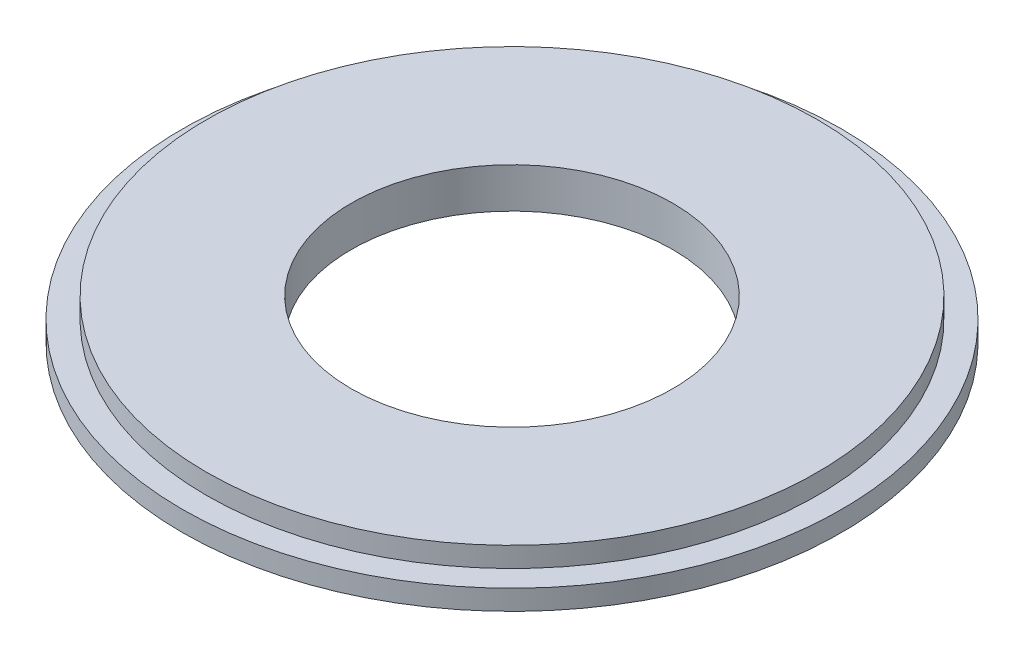
ISO-10303-21;
HEADER;
FILE_DESCRIPTION(('STEP AP214'),'2;1');
FILE_NAME('part.step','',(''),(''),'','','');
FILE_SCHEMA(('AUTOMOTIVE_DESIGN { 1 0 10303 214 1 1 1 1 }'));
ENDSEC;
DATA;
#1=APPLICATION_CONTEXT('core data for automotive mechanical design processes');
#2=APPLICATION_PROTOCOL_DEFINITION('international standard','automotive_design',2000,#1);
#3=PRODUCT_CONTEXT('',#1,'mechanical');
#4=PRODUCT('Part','Part','',(#3));
#5=PRODUCT_RELATED_PRODUCT_CATEGORY('part','',(#4));
#6=PRODUCT_DEFINITION_FORMATION('','',#4);
#7=PRODUCT_DEFINITION_CONTEXT('part definition',#1,'design');
#8=PRODUCT_DEFINITION('design','',#6,#7);
#9=PRODUCT_DEFINITION_SHAPE('','',#8);
#10=(LENGTH_UNIT() NAMED_UNIT(*) SI_UNIT(.MILLI.,.METRE.));
#11=(NAMED_UNIT(*) PLANE_ANGLE_UNIT() SI_UNIT($,.RADIAN.));
#12=(NAMED_UNIT(*) SI_UNIT($,.STERADIAN.) SOLID_ANGLE_UNIT());
#13=UNCERTAINTY_MEASURE_WITH_UNIT(LENGTH_MEASURE(1.E-05),#10,'distance_accuracy_value','');
#14=(GEOMETRIC_REPRESENTATION_CONTEXT(3) GLOBAL_UNCERTAINTY_ASSIGNED_CONTEXT((#13)) GLOBAL_UNIT_ASSIGNED_CONTEXT((#10,
#11,#12)) REPRESENTATION_CONTEXT('',''));
#15=CARTESIAN_POINT('',(0.,0.,0.));
#16=DIRECTION('',(0.,0.,1.));
#17=DIRECTION('',(1.,0.,0.));
#18=AXIS2_PLACEMENT_3D('',#15,#16,#17);
#19=CARTESIAN_POINT('',(0.,2.5,0.0159774867312799));
#20=DIRECTION('',(0.,1.,0.));
#21=DIRECTION('',(0.,0.,1.));
#22=AXIS2_PLACEMENT_3D('',#19,#20,#21);
#23=PLANE('',#22);
#24=CARTESIAN_POINT('',(0.,2.5,0.0159774867312799));
#25=DIRECTION('',(0.,1.,0.));
#26=DIRECTION('',(0.,0.,1.));
#27=AXIS2_PLACEMENT_3D('',#24,#25,#26);
#28=CIRCLE('',#27,38.);
#29=CARTESIAN_POINT('',(0.,2.5,38.0159774867313));
#30=VERTEX_POINT('',#29);
#31=EDGE_CURVE('E11',#30,#30,#28,.T.);
#32=ORIENTED_EDGE('',*,*,#31,.F.);
#33=EDGE_LOOP('',(#32));
#34=FACE_BOUND('',#33,.T.);
#35=CARTESIAN_POINT('',(0.,2.5,0.0159774867312799));
#36=DIRECTION('',(0.,1.,0.));
#37=DIRECTION('',(0.,0.,1.));
#38=AXIS2_PLACEMENT_3D('',#35,#36,#37);
#39=CIRCLE('',#38,41.);
#40=CARTESIAN_POINT('',(0.,2.5,41.0159774867313));
#41=VERTEX_POINT('',#40);
#42=EDGE_CURVE('E51',#41,#41,#39,.T.);
#43=ORIENTED_EDGE('',*,*,#42,.T.);
#44=EDGE_LOOP('',(#43));
#45=FACE_BOUND('',#44,.T.);
#46=ADVANCED_FACE('F43',(#34,#45),#23,.T.);
#47=CARTESIAN_POINT('',(0.,0.,0.0159774867312799));
#48=DIRECTION('',(0.,1.,0.));
#49=DIRECTION('',(0.,0.,1.));
#50=AXIS2_PLACEMENT_3D('',#47,#48,#49);
#51=PLANE('',#50);
#52=CARTESIAN_POINT('',(0.,0.,0.0159774867312799));
#53=DIRECTION('',(0.,1.,0.));
#54=DIRECTION('',(0.,0.,1.));
#55=AXIS2_PLACEMENT_3D('',#52,#53,#54);
#56=CIRCLE('',#55,41.);
#57=CARTESIAN_POINT('',(0.,0.,41.0159774867313));
#58=VERTEX_POINT('',#57);
#59=EDGE_CURVE('E47',#58,#58,#56,.T.);
#60=ORIENTED_EDGE('',*,*,#59,.F.);
#61=EDGE_LOOP('',(#60));
#62=FACE_BOUND('',#61,.T.);
#63=CARTESIAN_POINT('',(0.,0.,0.0159774867312799));
#64=DIRECTION('',(0.,1.,0.));
#65=DIRECTION('',(0.,0.,1.));
#66=AXIS2_PLACEMENT_3D('',#63,#64,#65);
#67=CIRCLE('',#66,20.);
#68=CARTESIAN_POINT('',(0.,0.,20.0159774867313));
#69=VERTEX_POINT('',#68);
#70=EDGE_CURVE('E60',#69,#69,#67,.T.);
#71=ORIENTED_EDGE('',*,*,#70,.T.);
#72=EDGE_LOOP('',(#71));
#73=FACE_BOUND('',#72,.T.);
#74=ADVANCED_FACE('F87',(#62,#73),#51,.F.);
#75=CARTESIAN_POINT('',(0.,2.5,0.0159774867312799));
#76=DIRECTION('',(0.,-1.,0.));
#77=DIRECTION('',(0.,0.,-1.));
#78=AXIS2_PLACEMENT_3D('',#75,#76,#77);
#79=CYLINDRICAL_SURFACE('',#78,41.);
#80=ORIENTED_EDGE('',*,*,#42,.F.);
#81=EDGE_LOOP('',(#80));
#82=FACE_BOUND('',#81,.T.);
#83=ORIENTED_EDGE('',*,*,#59,.T.);
#84=EDGE_LOOP('',(#83));
#85=FACE_BOUND('',#84,.T.);
#86=ADVANCED_FACE('F45',(#82,#85),#79,.T.);
#87=CARTESIAN_POINT('',(0.,2.5,0.0159774867312799));
#88=DIRECTION('',(0.,-1.,0.));
#89=DIRECTION('',(0.,0.,-1.));
#90=AXIS2_PLACEMENT_3D('',#87,#88,#89);
#91=CYLINDRICAL_SURFACE('',#90,20.);
#92=ORIENTED_EDGE('',*,*,#70,.F.);
#93=EDGE_LOOP('',(#92));
#94=FACE_BOUND('',#93,.T.);
#95=CARTESIAN_POINT('',(0.,5.,0.0159774867312799));
#96=DIRECTION('',(0.,1.,0.));
#97=DIRECTION('',(0.,0.,1.));
#98=AXIS2_PLACEMENT_3D('',#95,#96,#97);
#99=CIRCLE('',#98,20.);
#100=CARTESIAN_POINT('',(0.,5.,20.0159774867313));
#101=VERTEX_POINT('',#100);
#102=EDGE_CURVE('E66',#101,#101,#99,.T.);
#103=ORIENTED_EDGE('',*,*,#102,.T.);
#104=EDGE_LOOP('',(#103));
#105=FACE_BOUND('',#104,.T.);
#106=ADVANCED_FACE('F72',(#94,#105),#91,.F.);
#107=CARTESIAN_POINT('',(0.,5.,0.0159774867312799));
#108=DIRECTION('',(0.,1.,0.));
#109=DIRECTION('',(0.,0.,1.));
#110=AXIS2_PLACEMENT_3D('',#107,#108,#109);
#111=PLANE('',#110);
#112=CARTESIAN_POINT('',(0.,5.,0.0159774867312799));
#113=DIRECTION('',(0.,1.,0.));
#114=DIRECTION('',(0.,0.,1.));
#115=AXIS2_PLACEMENT_3D('',#112,#113,#114);
#116=CIRCLE('',#115,38.);
#117=CARTESIAN_POINT('',(0.,5.,38.0159774867313));
#118=VERTEX_POINT('',#117);
#119=EDGE_CURVE('E58',#118,#118,#116,.T.);
#120=ORIENTED_EDGE('',*,*,#119,.T.);
#121=EDGE_LOOP('',(#120));
#122=FACE_BOUND('',#121,.T.);
#123=ORIENTED_EDGE('',*,*,#102,.F.);
#124=EDGE_LOOP('',(#123));
#125=FACE_BOUND('',#124,.T.);
#126=ADVANCED_FACE('F74',(#122,#125),#111,.T.);
#127=CARTESIAN_POINT('',(0.,5.,0.0159774867312799));
#128=DIRECTION('',(0.,-1.,0.));
#129=DIRECTION('',(0.,0.,-1.));
#130=AXIS2_PLACEMENT_3D('',#127,#128,#129);
#131=CYLINDRICAL_SURFACE('',#130,38.);
#132=ORIENTED_EDGE('',*,*,#119,.F.);
#133=EDGE_LOOP('',(#132));
#134=FACE_BOUND('',#133,.T.);
#135=ORIENTED_EDGE('',*,*,#31,.T.);
#136=EDGE_LOOP('',(#135));
#137=FACE_BOUND('',#136,.T.);
#138=ADVANCED_FACE('F76',(#134,#137),#131,.T.);
#139=CLOSED_SHELL('',(#46,#74,#86,#106,#126,#138));
#140=MANIFOLD_SOLID_BREP('B2',#139);
#141=ADVANCED_BREP_SHAPE_REPRESENTATION('',(#18,#140),#14);
#142=SHAPE_DEFINITION_REPRESENTATION(#9,#141);
ENDSEC;
END-ISO-10303-21;
